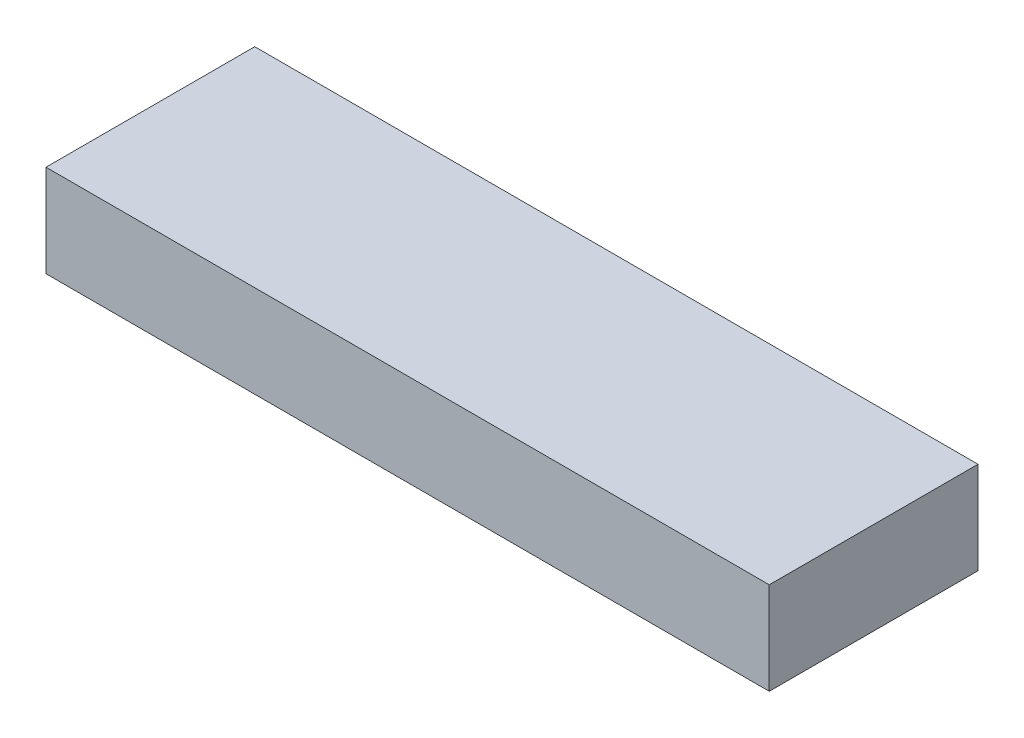
ISO-10303-21;
HEADER;
FILE_DESCRIPTION(('STEP AP214'),'2;1');
FILE_NAME('part.step','',(''),(''),'','','');
FILE_SCHEMA(('AUTOMOTIVE_DESIGN { 1 0 10303 214 1 1 1 1 }'));
ENDSEC;
DATA;
#1=APPLICATION_CONTEXT('core data for automotive mechanical design processes');
#2=APPLICATION_PROTOCOL_DEFINITION('international standard','automotive_design',2000,#1);
#3=PRODUCT_CONTEXT('',#1,'mechanical');
#4=PRODUCT('Part','Part','',(#3));
#5=PRODUCT_RELATED_PRODUCT_CATEGORY('part','',(#4));
#6=PRODUCT_DEFINITION_FORMATION('','',#4);
#7=PRODUCT_DEFINITION_CONTEXT('part definition',#1,'design');
#8=PRODUCT_DEFINITION('design','',#6,#7);
#9=PRODUCT_DEFINITION_SHAPE('','',#8);
#10=(LENGTH_UNIT() NAMED_UNIT(*) SI_UNIT(.MILLI.,.METRE.));
#11=(NAMED_UNIT(*) PLANE_ANGLE_UNIT() SI_UNIT($,.RADIAN.));
#12=(NAMED_UNIT(*) SI_UNIT($,.STERADIAN.) SOLID_ANGLE_UNIT());
#13=UNCERTAINTY_MEASURE_WITH_UNIT(LENGTH_MEASURE(1.E-05),#10,'distance_accuracy_value','');
#14=(GEOMETRIC_REPRESENTATION_CONTEXT(3) GLOBAL_UNCERTAINTY_ASSIGNED_CONTEXT((#13)) GLOBAL_UNIT_ASSIGNED_CONTEXT((#10,
#11,#12)) REPRESENTATION_CONTEXT('',''));
#15=CARTESIAN_POINT('',(0.,0.,0.));
#16=DIRECTION('',(0.,0.,1.));
#17=DIRECTION('',(1.,0.,0.));
#18=AXIS2_PLACEMENT_3D('',#15,#16,#17);
#19=CARTESIAN_POINT('',(-11.,2.8067,-3.175));
#20=DIRECTION('',(1.,0.,0.));
#21=DIRECTION('',(0.,0.,-1.));
#22=AXIS2_PLACEMENT_3D('',#19,#20,#21);
#23=PLANE('',#22);
#24=DIRECTION('',(0.,0.,-1.));
#25=VECTOR('',#24,1.);
#26=CARTESIAN_POINT('',(-11.,0.718921703931952,-1.25));
#27=LINE('',#26,#25);
#28=CARTESIAN_POINT('',(-11.,0.718921703931951,1.77293582987269));
#29=VERTEX_POINT('',#28);
#30=CARTESIAN_POINT('',(-11.,0.718921703931952,-1.77293582987269));
#31=VERTEX_POINT('',#30);
#32=EDGE_CURVE('E285',#29,#31,#27,.T.);
#33=ORIENTED_EDGE('',*,*,#32,.T.);
#34=CARTESIAN_POINT('',(-11.,0.776205675953109,-1.7586148368674));
#35=DIRECTION('',(1.,0.,0.));
#36=DIRECTION('',(0.,0.707106781186547,0.707106781186548));
#37=AXIS2_PLACEMENT_3D('',#34,#35,#36);
#38=ELLIPSE('',#37,0.0640454277302532,0.049609375);
#39=CARTESIAN_POINT('',(-11.,0.76188468294782,-1.81589880888856));
#40=VERTEX_POINT('',#39);
#41=EDGE_CURVE('E180',#31,#40,#38,.T.);
#42=ORIENTED_EDGE('',*,*,#41,.T.);
#43=DIRECTION('',(0.,1.,0.));
#44=VECTOR('',#43,1.);
#45=CARTESIAN_POINT('',(-11.,1.50917948717949,-1.81589880888856));
#46=LINE('',#45,#44);
#47=CARTESIAN_POINT('',(-11.,2.03211531705218,-1.81589880888856));
#48=VERTEX_POINT('',#47);
#49=EDGE_CURVE('E187',#40,#48,#46,.T.);
#50=ORIENTED_EDGE('',*,*,#49,.T.);
#51=CARTESIAN_POINT('',(-11.,2.01779432404689,-1.7586148368674));
#52=DIRECTION('',(1.,0.,0.));
#53=DIRECTION('',(0.,-0.707106781186548,0.707106781186547));
#54=AXIS2_PLACEMENT_3D('',#51,#52,#53);
#55=ELLIPSE('',#54,0.0640454277302532,0.049609375);
#56=CARTESIAN_POINT('',(-11.,2.07507829606805,-1.77293582987269));
#57=VERTEX_POINT('',#56);
#58=EDGE_CURVE('E52',#48,#57,#55,.T.);
#59=ORIENTED_EDGE('',*,*,#58,.T.);
#60=DIRECTION('',(0.,0.,1.));
#61=VECTOR('',#60,1.);
#62=CARTESIAN_POINT('',(-11.,2.07507829606805,1.25));
#63=LINE('',#62,#61);
#64=CARTESIAN_POINT('',(-11.,2.07507829606805,1.77293582987269));
#65=VERTEX_POINT('',#64);
#66=EDGE_CURVE('E143',#57,#65,#63,.T.);
#67=ORIENTED_EDGE('',*,*,#66,.T.);
#68=CARTESIAN_POINT('',(-11.,2.01779432404689,1.7586148368674));
#69=DIRECTION('',(1.,0.,0.));
#70=DIRECTION('',(0.,0.707106781186548,0.707106781186547));
#71=AXIS2_PLACEMENT_3D('',#68,#69,#70);
#72=ELLIPSE('',#71,0.0640454277302532,0.049609375);
#73=CARTESIAN_POINT('',(-11.,2.03211531705218,1.81589880888856));
#74=VERTEX_POINT('',#73);
#75=EDGE_CURVE('E178',#65,#74,#72,.T.);
#76=ORIENTED_EDGE('',*,*,#75,.T.);
#77=DIRECTION('',(0.,-1.,0.));
#78=VECTOR('',#77,1.);
#79=CARTESIAN_POINT('',(-11.,1.28482051282051,1.81589880888856));
#80=LINE('',#79,#78);
#81=CARTESIAN_POINT('',(-11.,0.761884682947819,1.81589880888856));
#82=VERTEX_POINT('',#81);
#83=EDGE_CURVE('E157',#74,#82,#80,.T.);
#84=ORIENTED_EDGE('',*,*,#83,.T.);
#85=CARTESIAN_POINT('',(-11.,0.776205675953109,1.7586148368674));
#86=DIRECTION('',(1.,0.,0.));
#87=DIRECTION('',(0.,-0.707106781186548,0.707106781186547));
#88=AXIS2_PLACEMENT_3D('',#85,#86,#87);
#89=ELLIPSE('',#88,0.0640454277302532,0.049609375);
#90=EDGE_CURVE('E176',#82,#29,#89,.T.);
#91=ORIENTED_EDGE('',*,*,#90,.T.);
#92=EDGE_LOOP('',(#33,#42,#50,#59,#67,#76,#84,#91));
#93=FACE_BOUND('',#92,.T.);
#94=DIRECTION('',(0.,0.,1.));
#95=VECTOR('',#94,1.);
#96=CARTESIAN_POINT('',(-11.,0.,-3.175));
#97=LINE('',#96,#95);
#98=CARTESIAN_POINT('',(-11.,0.,-3.175));
#99=VERTEX_POINT('',#98);
#100=CARTESIAN_POINT('',(-11.,0.,3.175));
#101=VERTEX_POINT('',#100);
#102=EDGE_CURVE('E305',#99,#101,#97,.T.);
#103=ORIENTED_EDGE('',*,*,#102,.T.);
#104=DIRECTION('',(0.,-1.,0.));
#105=VECTOR('',#104,1.);
#106=CARTESIAN_POINT('',(-11.,2.8067,3.175));
#107=LINE('',#106,#105);
#108=CARTESIAN_POINT('',(-11.,2.8067,3.175));
#109=VERTEX_POINT('',#108);
#110=EDGE_CURVE('E296',#109,#101,#107,.T.);
#111=ORIENTED_EDGE('',*,*,#110,.F.);
#112=DIRECTION('',(0.,0.,1.));
#113=VECTOR('',#112,1.);
#114=CARTESIAN_POINT('',(-11.,2.8067,-3.175));
#115=LINE('',#114,#113);
#116=CARTESIAN_POINT('',(-11.,2.8067,-3.175));
#117=VERTEX_POINT('',#116);
#118=EDGE_CURVE('E312',#117,#109,#115,.T.);
#119=ORIENTED_EDGE('',*,*,#118,.F.);
#120=DIRECTION('',(0.,-1.,0.));
#121=VECTOR('',#120,1.);
#122=CARTESIAN_POINT('',(-11.,2.8067,-3.175));
#123=LINE('',#122,#121);
#124=EDGE_CURVE('E293',#117,#99,#123,.T.);
#125=ORIENTED_EDGE('',*,*,#124,.T.);
#126=EDGE_LOOP('',(#103,#111,#119,#125));
#127=FACE_BOUND('',#126,.T.);
#128=ADVANCED_FACE('F38',(#93,#127),#23,.F.);
#129=CARTESIAN_POINT('',(11.,2.8067,-3.175));
#130=DIRECTION('',(-1.,0.,0.));
#131=DIRECTION('',(0.,0.,1.));
#132=AXIS2_PLACEMENT_3D('',#129,#130,#131);
#133=PLANE('',#132);
#134=DIRECTION('',(0.,0.,-1.));
#135=VECTOR('',#134,1.);
#136=CARTESIAN_POINT('',(11.,0.,-3.175));
#137=LINE('',#136,#135);
#138=CARTESIAN_POINT('',(11.,0.,3.175));
#139=VERTEX_POINT('',#138);
#140=CARTESIAN_POINT('',(11.,0.,-3.175));
#141=VERTEX_POINT('',#140);
#142=EDGE_CURVE('E230',#139,#141,#137,.T.);
#143=ORIENTED_EDGE('',*,*,#142,.T.);
#144=DIRECTION('',(0.,-1.,0.));
#145=VECTOR('',#144,1.);
#146=CARTESIAN_POINT('',(11.,2.8067,-3.175));
#147=LINE('',#146,#145);
#148=CARTESIAN_POINT('',(11.,2.8067,-3.175));
#149=VERTEX_POINT('',#148);
#150=EDGE_CURVE('E290',#149,#141,#147,.T.);
#151=ORIENTED_EDGE('',*,*,#150,.F.);
#152=DIRECTION('',(0.,0.,-1.));
#153=VECTOR('',#152,1.);
#154=CARTESIAN_POINT('',(11.,2.8067,-3.175));
#155=LINE('',#154,#153);
#156=CARTESIAN_POINT('',(11.,2.8067,3.175));
#157=VERTEX_POINT('',#156);
#158=EDGE_CURVE('E231',#157,#149,#155,.T.);
#159=ORIENTED_EDGE('',*,*,#158,.F.);
#160=DIRECTION('',(0.,-1.,0.));
#161=VECTOR('',#160,1.);
#162=CARTESIAN_POINT('',(11.,2.8067,3.175));
#163=LINE('',#162,#161);
#164=EDGE_CURVE('E299',#157,#139,#163,.T.);
#165=ORIENTED_EDGE('',*,*,#164,.T.);
#166=EDGE_LOOP('',(#143,#151,#159,#165));
#167=FACE_BOUND('',#166,.T.);
#168=ADVANCED_FACE('F247',(#167),#133,.F.);
#169=CARTESIAN_POINT('',(11.,2.8067,-3.175));
#170=DIRECTION('',(0.,0.,1.));
#171=DIRECTION('',(1.,0.,0.));
#172=AXIS2_PLACEMENT_3D('',#169,#170,#171);
#173=PLANE('',#172);
#174=DIRECTION('',(-1.,0.,0.));
#175=VECTOR('',#174,1.);
#176=CARTESIAN_POINT('',(11.,0.,-3.175));
#177=LINE('',#176,#175);
#178=EDGE_CURVE('E307',#141,#99,#177,.T.);
#179=ORIENTED_EDGE('',*,*,#178,.T.);
#180=ORIENTED_EDGE('',*,*,#124,.F.);
#181=DIRECTION('',(-1.,0.,0.));
#182=VECTOR('',#181,1.);
#183=CARTESIAN_POINT('',(11.,2.8067,-3.175));
#184=LINE('',#183,#182);
#185=EDGE_CURVE('E313',#149,#117,#184,.T.);
#186=ORIENTED_EDGE('',*,*,#185,.F.);
#187=ORIENTED_EDGE('',*,*,#150,.T.);
#188=EDGE_LOOP('',(#179,#180,#186,#187));
#189=FACE_BOUND('',#188,.T.);
#190=ADVANCED_FACE('F252',(#189),#173,.F.);
#191=CARTESIAN_POINT('',(11.,2.8067,3.175));
#192=DIRECTION('',(0.,0.,-1.));
#193=DIRECTION('',(-1.,0.,0.));
#194=AXIS2_PLACEMENT_3D('',#191,#192,#193);
#195=PLANE('',#194);
#196=DIRECTION('',(1.,0.,0.));
#197=VECTOR('',#196,1.);
#198=CARTESIAN_POINT('',(11.,0.,3.175));
#199=LINE('',#198,#197);
#200=EDGE_CURVE('E303',#101,#139,#199,.T.);
#201=ORIENTED_EDGE('',*,*,#200,.T.);
#202=ORIENTED_EDGE('',*,*,#164,.F.);
#203=DIRECTION('',(1.,0.,0.));
#204=VECTOR('',#203,1.);
#205=CARTESIAN_POINT('',(11.,2.8067,3.175));
#206=LINE('',#205,#204);
#207=EDGE_CURVE('E302',#109,#157,#206,.T.);
#208=ORIENTED_EDGE('',*,*,#207,.F.);
#209=ORIENTED_EDGE('',*,*,#110,.T.);
#210=EDGE_LOOP('',(#201,#202,#208,#209));
#211=FACE_BOUND('',#210,.T.);
#212=ADVANCED_FACE('F257',(#211),#195,.F.);
#213=CARTESIAN_POINT('',(0.,2.8067,0.));
#214=DIRECTION('',(0.,-1.,0.));
#215=DIRECTION('',(0.,0.,-1.));
#216=AXIS2_PLACEMENT_3D('',#213,#214,#215);
#217=PLANE('',#216);
#218=ORIENTED_EDGE('',*,*,#158,.T.);
#219=ORIENTED_EDGE('',*,*,#185,.T.);
#220=ORIENTED_EDGE('',*,*,#118,.T.);
#221=ORIENTED_EDGE('',*,*,#207,.T.);
#222=EDGE_LOOP('',(#218,#219,#220,#221));
#223=FACE_BOUND('',#222,.T.);
#224=ADVANCED_FACE('F219',(#223),#217,.F.);
#225=CARTESIAN_POINT('',(0.,0.,0.));
#226=DIRECTION('',(0.,-1.,0.));
#227=DIRECTION('',(0.,0.,-1.));
#228=AXIS2_PLACEMENT_3D('',#225,#226,#227);
#229=PLANE('',#228);
#230=ORIENTED_EDGE('',*,*,#142,.F.);
#231=ORIENTED_EDGE('',*,*,#200,.F.);
#232=ORIENTED_EDGE('',*,*,#102,.F.);
#233=ORIENTED_EDGE('',*,*,#178,.F.);
#234=EDGE_LOOP('',(#230,#231,#232,#233));
#235=FACE_BOUND('',#234,.T.);
#236=ADVANCED_FACE('F277',(#235),#229,.T.);
#237=CARTESIAN_POINT('',(-12.0780205827676,1.34131717758477,-1.25));
#238=DIRECTION('',(0.500000000000005,0.866025403784436,0.));
#239=DIRECTION('',(0.,0.,1.));
#240=AXIS2_PLACEMENT_3D('',#237,#238,#239);
#241=PLANE('',#240);
#242=DIRECTION('',(0.774596669241479,-0.447213595499962,0.447213595499961));
#243=VECTOR('',#242,1.);
#244=CARTESIAN_POINT('',(-12.909592155286,1.82142524882875,0.670432284975891));
#245=LINE('',#244,#243);
#246=CARTESIAN_POINT('',(-12.0696651203595,1.33649314911429,1.15536438469035));
#247=VERTEX_POINT('',#246);
#248=EDGE_CURVE('E165',#29,#247,#245,.F.);
#249=ORIENTED_EDGE('',*,*,#248,.T.);
#250=CARTESIAN_POINT('',(-18.3136728989092,4.94147272088212,0.));
#251=DIRECTION('',(0.500000000000005,0.866025403784436,0.));
#252=DIRECTION('',(0.866025403784436,-0.500000000000005,0.));
#253=AXIS2_PLACEMENT_3D('',#250,#251,#252);
#254=ELLIPSE('',#253,7.33234841870827,6.35);
#255=CARTESIAN_POINT('',(-12.0696651203595,1.33649314911428,-1.15536438469036));
#256=VERTEX_POINT('',#255);
#257=EDGE_CURVE('E201',#247,#256,#254,.T.);
#258=ORIENTED_EDGE('',*,*,#257,.T.);
#259=DIRECTION('',(-0.774596669241479,0.447213595499961,0.447213595499962));
#260=VECTOR('',#259,1.);
#261=CARTESIAN_POINT('',(-12.0435667515016,1.32142524882875,-1.1704322849759));
#262=LINE('',#261,#260);
#263=EDGE_CURVE('E160',#256,#31,#262,.F.);
#264=ORIENTED_EDGE('',*,*,#263,.T.);
#265=ORIENTED_EDGE('',*,*,#32,.F.);
#266=EDGE_LOOP('',(#249,#258,#264,#265));
#267=FACE_BOUND('',#266,.T.);
#268=ADVANCED_FACE('F239',(#267),#241,.F.);
#269=CARTESIAN_POINT('',(-12.0780205827676,1.28482051282051,1.19350333523574));
#270=DIRECTION('',(0.500000000000005,0.,-0.866025403784436));
#271=DIRECTION('',(0.,1.,0.));
#272=AXIS2_PLACEMENT_3D('',#269,#270,#271);
#273=PLANE('',#272);
#274=DIRECTION('',(0.,1.,0.));
#275=VECTOR('',#274,1.);
#276=CARTESIAN_POINT('',(-12.07696,1.28482051282051,1.19411566298209));
#277=LINE('',#276,#275);
#278=CARTESIAN_POINT('',(-12.07696,1.38366782885429,1.1941156629821));
#279=VERTEX_POINT('',#278);
#280=CARTESIAN_POINT('',(-12.07696,1.41033217114571,1.1941156629821));
#281=VERTEX_POINT('',#280);
#282=EDGE_CURVE('E132',#279,#281,#277,.T.);
#283=ORIENTED_EDGE('',*,*,#282,.F.);
#284=DIRECTION('',(0.77459666924148,-0.447213595499962,0.447213595499961));
#285=VECTOR('',#284,1.);
#286=CARTESIAN_POINT('',(-12.0435667515016,1.36438822784461,1.21339526399177));
#287=LINE('',#286,#285);
#288=EDGE_CURVE('E158',#279,#82,#287,.T.);
#289=ORIENTED_EDGE('',*,*,#288,.T.);
#290=ORIENTED_EDGE('',*,*,#83,.F.);
#291=DIRECTION('',(0.774596669241479,0.447213595499962,0.447213595499961));
#292=VECTOR('',#291,1.);
#293=CARTESIAN_POINT('',(-12.1212869800463,1.38473997728359,1.16852346911997));
#294=LINE('',#293,#292);
#295=EDGE_CURVE('E150',#74,#281,#294,.F.);
#296=ORIENTED_EDGE('',*,*,#295,.T.);
#297=EDGE_LOOP('',(#283,#289,#290,#296));
#298=FACE_BOUND('',#297,.T.);
#299=ADVANCED_FACE('F155',(#298),#273,.F.);
#300=CARTESIAN_POINT('',(-12.0780205827676,1.50917948717949,-1.19350333523574));
#301=DIRECTION('',(0.500000000000005,0.,0.866025403784436));
#302=DIRECTION('',(0.,-1.,0.));
#303=AXIS2_PLACEMENT_3D('',#300,#301,#302);
#304=PLANE('',#303);
#305=ORIENTED_EDGE('',*,*,#49,.F.);
#306=DIRECTION('',(-0.774596669241479,0.447213595499961,0.447213595499962));
#307=VECTOR('',#306,1.);
#308=CARTESIAN_POINT('',(-12.1212869800463,1.40926002271641,-1.16852346911997));
#309=LINE('',#308,#307);
#310=CARTESIAN_POINT('',(-12.07696,1.38366782885428,-1.1941156629821));
#311=VERTEX_POINT('',#310);
#312=EDGE_CURVE('E173',#40,#311,#309,.T.);
#313=ORIENTED_EDGE('',*,*,#312,.T.);
#314=DIRECTION('',(0.,-1.,0.));
#315=VECTOR('',#314,1.);
#316=CARTESIAN_POINT('',(-12.07696,1.50917948717949,-1.1941156629821));
#317=LINE('',#316,#315);
#318=CARTESIAN_POINT('',(-12.07696,1.41033217114572,-1.19411566298211));
#319=VERTEX_POINT('',#318);
#320=EDGE_CURVE('E142',#319,#311,#317,.T.);
#321=ORIENTED_EDGE('',*,*,#320,.F.);
#322=DIRECTION('',(-0.774596669241479,-0.447213595499962,0.447213595499962));
#323=VECTOR('',#322,1.);
#324=CARTESIAN_POINT('',(-12.0435667515016,1.42961177215539,-1.21339526399177));
#325=LINE('',#324,#323);
#326=EDGE_CURVE('E66',#319,#48,#325,.F.);
#327=ORIENTED_EDGE('',*,*,#326,.T.);
#328=EDGE_LOOP('',(#305,#313,#321,#327));
#329=FACE_BOUND('',#328,.T.);
#330=ADVANCED_FACE('F194',(#329),#304,.F.);
#331=CARTESIAN_POINT('',(-12.0780205827676,1.45268282241523,1.25));
#332=DIRECTION('',(0.500000000000005,-0.866025403784436,0.));
#333=DIRECTION('',(0.,0.,-1.));
#334=AXIS2_PLACEMENT_3D('',#331,#332,#333);
#335=PLANE('',#334);
#336=DIRECTION('',(-0.774596669241479,-0.447213595499962,0.447213595499961));
#337=VECTOR('',#336,1.);
#338=CARTESIAN_POINT('',(-12.909592155286,0.972574751171246,-0.670432284975891));
#339=LINE('',#338,#337);
#340=CARTESIAN_POINT('',(-12.0696651203595,1.45750685088572,-1.15536438469036));
#341=VERTEX_POINT('',#340);
#342=EDGE_CURVE('E168',#57,#341,#339,.T.);
#343=ORIENTED_EDGE('',*,*,#342,.T.);
#344=CARTESIAN_POINT('',(-18.3136728989092,-2.14747272088212,0.));
#345=DIRECTION('',(0.500000000000005,-0.866025403784436,0.));
#346=DIRECTION('',(-0.866025403784436,-0.500000000000005,0.));
#347=AXIS2_PLACEMENT_3D('',#344,#345,#346);
#348=ELLIPSE('',#347,7.33234841870827,6.35);
#349=CARTESIAN_POINT('',(-12.0696651203595,1.45750685088571,1.15536438469035));
#350=VERTEX_POINT('',#349);
#351=EDGE_CURVE('E58',#341,#350,#348,.T.);
#352=ORIENTED_EDGE('',*,*,#351,.T.);
#353=DIRECTION('',(0.774596669241479,0.447213595499962,0.447213595499961));
#354=VECTOR('',#353,1.);
#355=CARTESIAN_POINT('',(-12.0435667515016,1.47257475117125,1.1704322849759));
#356=LINE('',#355,#354);
#357=EDGE_CURVE('E151',#350,#65,#356,.T.);
#358=ORIENTED_EDGE('',*,*,#357,.T.);
#359=ORIENTED_EDGE('',*,*,#66,.F.);
#360=EDGE_LOOP('',(#343,#352,#358,#359));
#361=FACE_BOUND('',#360,.T.);
#362=ADVANCED_FACE('F191',(#361),#335,.F.);
#363=CARTESIAN_POINT('',(-12.0187620640016,1.36438822784461,1.1704322849759));
#364=DIRECTION('',(0.774596669241479,-0.447213595499962,0.447213595499961));
#365=DIRECTION('',(0.500000000000005,0.866025403784436,0.));
#366=AXIS2_PLACEMENT_3D('',#363,#364,#365);
#367=CYLINDRICAL_SURFACE('',#366,0.049609375);
#368=CARTESIAN_POINT('',(-12.0696651203595,1.33649314911429,1.15536438469035));
#369=CARTESIAN_POINT('',(-12.0701007838237,1.33674124851865,1.15771915311523));
#370=CARTESIAN_POINT('',(-12.0705345894729,1.33718466167882,1.16005587117648));
#371=CARTESIAN_POINT('',(-12.0713854465756,1.3384556624906,1.16462551506286));
#372=CARTESIAN_POINT('',(-12.0718024961062,1.33928329410152,1.16685842897937));
#373=CARTESIAN_POINT('',(-12.0726076432807,1.34131861187382,1.17115725696663));
#374=CARTESIAN_POINT('',(-12.0729956704582,1.34252718813234,1.17322276553));
#375=CARTESIAN_POINT('',(-12.0737286619899,1.34528823857551,1.1771150481331));
#376=CARTESIAN_POINT('',(-12.0740736632488,1.34684041482776,1.17894202683121));
#377=CARTESIAN_POINT('',(-12.0747031389139,1.35019601319818,1.18226864182892));
#378=CARTESIAN_POINT('',(-12.0749888820938,1.35199240086686,1.18377516295475));
#379=CARTESIAN_POINT('',(-12.0755042225288,1.35580654980778,1.18648787567596));
#380=CARTESIAN_POINT('',(-12.0757337901774,1.35782442700473,1.18769390890978));
#381=CARTESIAN_POINT('',(-12.0761444332281,1.36213316836978,1.18984868851542));
#382=CARTESIAN_POINT('',(-12.076322286029,1.36443283881861,1.19078037044591));
#383=CARTESIAN_POINT('',(-12.0766122391335,1.36914605965403,1.19229818484385));
#384=CARTESIAN_POINT('',(-12.076724314636,1.37155965262457,1.19288418697449));
#385=CARTESIAN_POINT('',(-12.0769095141981,1.37719228496253,1.19385200379772));
#386=CARTESIAN_POINT('',(-12.0769603868852,1.38043280007723,1.19411731444017));
#387=CARTESIAN_POINT('',(-12.07696,1.38366782885429,1.1941156629821));
#388=B_SPLINE_CURVE_WITH_KNOTS('',3,(#368,#369,#370,#371,#372,#373,#374,#375,#376,#377,#378,
#379,#380,#381,#382,#383,#384,#385,#386,#387),.UNSPECIFIED.,.F.,.F.,(4,2,2,2,2,2,2,2,2,4),(0.,
0.00721835293733839,0.0144375319463932,0.0216737055724054,0.0289036291858531,0.0359575861783727,
0.043015252884137,0.050447717689665,0.0578829830802125,0.0675822166938418),.UNSPECIFIED.);
#389=EDGE_CURVE('E137',#247,#279,#388,.T.);
#390=ORIENTED_EDGE('',*,*,#389,.F.);
#391=ORIENTED_EDGE('',*,*,#248,.F.);
#392=ORIENTED_EDGE('',*,*,#90,.F.);
#393=ORIENTED_EDGE('',*,*,#288,.F.);
#394=EDGE_LOOP('',(#390,#391,#392,#393));
#395=FACE_BOUND('',#394,.T.);
#396=ADVANCED_FACE('F233',(#395),#367,.T.);
#397=CARTESIAN_POINT('',(-12.0187620640016,1.42961177215539,1.1704322849759));
#398=DIRECTION('',(0.774596669241479,0.447213595499962,0.447213595499961));
#399=DIRECTION('',(-0.500000000000005,0.866025403784436,0.));
#400=AXIS2_PLACEMENT_3D('',#397,#398,#399);
#401=CYLINDRICAL_SURFACE('',#400,0.049609375);
#402=CARTESIAN_POINT('',(-12.07696,1.41033217114571,1.1941156629821));
#403=CARTESIAN_POINT('',(-12.0769603742402,1.41323918212696,1.19411730689938));
#404=CARTESIAN_POINT('',(-12.0769192827342,1.41615251637534,1.19390298123375));
#405=CARTESIAN_POINT('',(-12.0767496427141,1.42192562728777,1.19301664242615));
#406=CARTESIAN_POINT('',(-12.0766204962388,1.42478489951122,1.19234149994909));
#407=CARTESIAN_POINT('',(-12.0762692987333,1.43035417831349,1.19050289962258));
#408=CARTESIAN_POINT('',(-12.0760468240764,1.43306343968491,1.18933721507274));
#409=CARTESIAN_POINT('',(-12.0755105711334,1.43819926207896,1.18652131052158));
#410=CARTESIAN_POINT('',(-12.0751970909668,1.44062671049661,1.18487267244163));
#411=CARTESIAN_POINT('',(-12.0745268007571,1.44483898542663,1.18133771965048));
#412=CARTESIAN_POINT('',(-12.0741788856529,1.44666542869185,1.1794992915941));
#413=CARTESIAN_POINT('',(-12.0734277842704,1.44994041500437,1.17551903098744));
#414=CARTESIAN_POINT('',(-12.0730245761572,1.45138880810167,1.17337707856526));
#415=CARTESIAN_POINT('',(-12.0722162656003,1.45374388781928,1.16906948581515));
#416=CARTESIAN_POINT('',(-12.0718145795868,1.45468752018785,1.16692321705428));
#417=CARTESIAN_POINT('',(-12.0709911143847,1.45619973027893,1.16250984606274));
#418=CARTESIAN_POINT('',(-12.0705693702606,1.45676893845405,1.16024295393134));
#419=CARTESIAN_POINT('',(-12.0699846495031,1.45729694081696,1.15709024285702));
#420=CARTESIAN_POINT('',(-12.06982498383,1.45741478449869,1.15622836428991));
#421=CARTESIAN_POINT('',(-12.0696651203595,1.45750685088571,1.15536438469035));
#422=B_SPLINE_CURVE_WITH_KNOTS('',3,(#402,#403,#404,#405,#406,#407,#408,#409,#410,#411,#412,
#413,#414,#415,#416,#417,#418,#419,#420,#421),.UNSPECIFIED.,.F.,.F.,(4,2,2,2,2,2,2,2,2,4),(0.,
0.00872251423313518,0.0175048588734806,0.0263275064022994,0.0351215723252653,0.0429222296603542,
0.0507259763664661,0.0578294894502011,0.0649210108656833,0.0675725023056921),.UNSPECIFIED.);
#423=EDGE_CURVE('E135',#281,#350,#422,.T.);
#424=ORIENTED_EDGE('',*,*,#423,.F.);
#425=ORIENTED_EDGE('',*,*,#295,.F.);
#426=ORIENTED_EDGE('',*,*,#75,.F.);
#427=ORIENTED_EDGE('',*,*,#357,.F.);
#428=EDGE_LOOP('',(#424,#425,#426,#427));
#429=FACE_BOUND('',#428,.T.);
#430=ADVANCED_FACE('F148',(#429),#401,.T.);
#431=CARTESIAN_POINT('',(-12.0964822925463,1.40926002271641,-1.1255604901041));
#432=DIRECTION('',(-0.774596669241479,0.447213595499961,0.447213595499962));
#433=DIRECTION('',(0.500000000000005,0.,0.866025403784436));
#434=AXIS2_PLACEMENT_3D('',#431,#432,#433);
#435=CYLINDRICAL_SURFACE('',#434,0.049609375);
#436=CARTESIAN_POINT('',(-12.07696,1.38366782885428,-1.1941156629821));
#437=CARTESIAN_POINT('',(-12.0769603742402,1.38076081787303,-1.19411730689939));
#438=CARTESIAN_POINT('',(-12.0769192827342,1.37784748362465,-1.19390298123376));
#439=CARTESIAN_POINT('',(-12.076749642714,1.37207437271222,-1.19301664242616));
#440=CARTESIAN_POINT('',(-12.0766204962387,1.36921510048877,-1.1923414999491));
#441=CARTESIAN_POINT('',(-12.0762692987333,1.3636458216865,-1.19050289962259));
#442=CARTESIAN_POINT('',(-12.0760468240764,1.36093656031508,-1.18933721507275));
#443=CARTESIAN_POINT('',(-12.0755105711334,1.35580073792103,-1.18652131052159));
#444=CARTESIAN_POINT('',(-12.0751970909668,1.35337328950338,-1.18487267244164));
#445=CARTESIAN_POINT('',(-12.0745268007571,1.34916101457336,-1.18133771965049));
#446=CARTESIAN_POINT('',(-12.0741788856529,1.34733457130814,-1.17949929159411));
#447=CARTESIAN_POINT('',(-12.0734277842704,1.34405958499562,-1.17551903098745));
#448=CARTESIAN_POINT('',(-12.0730245761571,1.34261119189832,-1.17337707856527));
#449=CARTESIAN_POINT('',(-12.0722162656003,1.34025611218072,-1.16906948581516));
#450=CARTESIAN_POINT('',(-12.0718145795868,1.33931247981214,-1.16692321705429));
#451=CARTESIAN_POINT('',(-12.0709911143846,1.33780026972106,-1.16250984606275));
#452=CARTESIAN_POINT('',(-12.0705693702606,1.33723106154594,-1.16024295393135));
#453=CARTESIAN_POINT('',(-12.0699846495031,1.33670305918303,-1.15709024285703));
#454=CARTESIAN_POINT('',(-12.06982498383,1.3365852155013,-1.15622836428992));
#455=CARTESIAN_POINT('',(-12.0696651203595,1.33649314911428,-1.15536438469036));
#456=B_SPLINE_CURVE_WITH_KNOTS('',3,(#436,#437,#438,#439,#440,#441,#442,#443,#444,#445,#446,
#447,#448,#449,#450,#451,#452,#453,#454,#455),.UNSPECIFIED.,.F.,.F.,(4,2,2,2,2,2,2,2,2,4),(0.,
0.00872251423313537,0.017504858873481,0.0263275064022999,0.0351215723252657,0.0429222296603549,
0.0507259763664669,0.0578294894502011,0.0649210108656829,0.067572502305692),.UNSPECIFIED.);
#457=EDGE_CURVE('E152',#311,#256,#456,.T.);
#458=ORIENTED_EDGE('',*,*,#457,.F.);
#459=ORIENTED_EDGE('',*,*,#312,.F.);
#460=ORIENTED_EDGE('',*,*,#41,.F.);
#461=ORIENTED_EDGE('',*,*,#263,.F.);
#462=EDGE_LOOP('',(#458,#459,#460,#461));
#463=FACE_BOUND('',#462,.T.);
#464=ADVANCED_FACE('F198',(#463),#435,.T.);
#465=CARTESIAN_POINT('',(-12.884787467786,0.929611772155377,-0.670432284975891));
#466=DIRECTION('',(-0.774596669241479,-0.447213595499962,0.447213595499961));
#467=DIRECTION('',(0.500000000000005,-0.866025403784436,0.));
#468=AXIS2_PLACEMENT_3D('',#465,#466,#467);
#469=CYLINDRICAL_SURFACE('',#468,0.049609375);
#470=CARTESIAN_POINT('',(-12.0696651203595,1.45750685088572,-1.15536438469036));
#471=CARTESIAN_POINT('',(-12.0701007838237,1.45725875148136,-1.15771915311524));
#472=CARTESIAN_POINT('',(-12.0705345894729,1.45681533832119,-1.16005587117648));
#473=CARTESIAN_POINT('',(-12.0713854465756,1.45554433750941,-1.16462551506287));
#474=CARTESIAN_POINT('',(-12.0718024961062,1.45471670589849,-1.16685842897938));
#475=CARTESIAN_POINT('',(-12.0726076432807,1.45268138812619,-1.17115725696664));
#476=CARTESIAN_POINT('',(-12.0729956704581,1.45147281186767,-1.17322276553001));
#477=CARTESIAN_POINT('',(-12.0737286619898,1.4487117614245,-1.17711504813311));
#478=CARTESIAN_POINT('',(-12.0740736632488,1.44715958517225,-1.17894202683122));
#479=CARTESIAN_POINT('',(-12.0747031389139,1.44380398680183,-1.18226864182893));
#480=CARTESIAN_POINT('',(-12.0749888820938,1.44200759913315,-1.18377516295476));
#481=CARTESIAN_POINT('',(-12.0755042225288,1.43819345019223,-1.18648787567597));
#482=CARTESIAN_POINT('',(-12.0757337901774,1.43617557299528,-1.18769390890979));
#483=CARTESIAN_POINT('',(-12.0761444332281,1.43186683163023,-1.18984868851543));
#484=CARTESIAN_POINT('',(-12.0763222860289,1.4295671611814,-1.19078037044592));
#485=CARTESIAN_POINT('',(-12.0766122391335,1.42485394034598,-1.19229818484386));
#486=CARTESIAN_POINT('',(-12.076724314636,1.42244034737544,-1.1928841869745));
#487=CARTESIAN_POINT('',(-12.0769095141981,1.41680771503748,-1.19385200379773));
#488=CARTESIAN_POINT('',(-12.0769603868852,1.41356719992278,-1.19411731444018));
#489=CARTESIAN_POINT('',(-12.07696,1.41033217114572,-1.19411566298211));
#490=B_SPLINE_CURVE_WITH_KNOTS('',3,(#470,#471,#472,#473,#474,#475,#476,#477,#478,#479,#480,
#481,#482,#483,#484,#485,#486,#487,#488,#489),.UNSPECIFIED.,.F.,.F.,(4,2,2,2,2,2,2,2,2,4),(0.,
0.00721835293733831,0.0144375319463937,0.0216737055724067,0.0289036291858538,0.0359575861783729,
0.0430152528841376,0.0504477176896656,0.057882983080213,0.0675822166938426),.UNSPECIFIED.);
#491=EDGE_CURVE('E11',#341,#319,#490,.T.);
#492=ORIENTED_EDGE('',*,*,#491,.F.);
#493=ORIENTED_EDGE('',*,*,#342,.F.);
#494=ORIENTED_EDGE('',*,*,#58,.F.);
#495=ORIENTED_EDGE('',*,*,#326,.F.);
#496=EDGE_LOOP('',(#492,#493,#494,#495));
#497=FACE_BOUND('',#496,.T.);
#498=ADVANCED_FACE('F40',(#497),#469,.T.);
#499=CARTESIAN_POINT('',(-18.3136728989092,2.8067,0.));
#500=DIRECTION('',(0.,-1.,0.));
#501=DIRECTION('',(0.,0.,-1.));
#502=AXIS2_PLACEMENT_3D('',#499,#500,#501);
#503=CYLINDRICAL_SURFACE('',#502,6.35);
#504=ORIENTED_EDGE('',*,*,#389,.T.);
#505=ORIENTED_EDGE('',*,*,#282,.T.);
#506=ORIENTED_EDGE('',*,*,#423,.T.);
#507=ORIENTED_EDGE('',*,*,#351,.F.);
#508=ORIENTED_EDGE('',*,*,#491,.T.);
#509=ORIENTED_EDGE('',*,*,#320,.T.);
#510=ORIENTED_EDGE('',*,*,#457,.T.);
#511=ORIENTED_EDGE('',*,*,#257,.F.);
#512=EDGE_LOOP('',(#504,#505,#506,#507,#508,#509,#510,#511));
#513=FACE_BOUND('',#512,.T.);
#514=ADVANCED_FACE('F134',(#513),#503,.F.);
#515=CLOSED_SHELL('',(#128,#168,#190,#212,#224,#236,#268,#299,#330,#362,#396,#430,#464,#498,#514));
#516=MANIFOLD_SOLID_BREP('B2',#515);
#517=ADVANCED_BREP_SHAPE_REPRESENTATION('',(#18,#516),#14);
#518=SHAPE_DEFINITION_REPRESENTATION(#9,#517);
ENDSEC;
END-ISO-10303-21;
